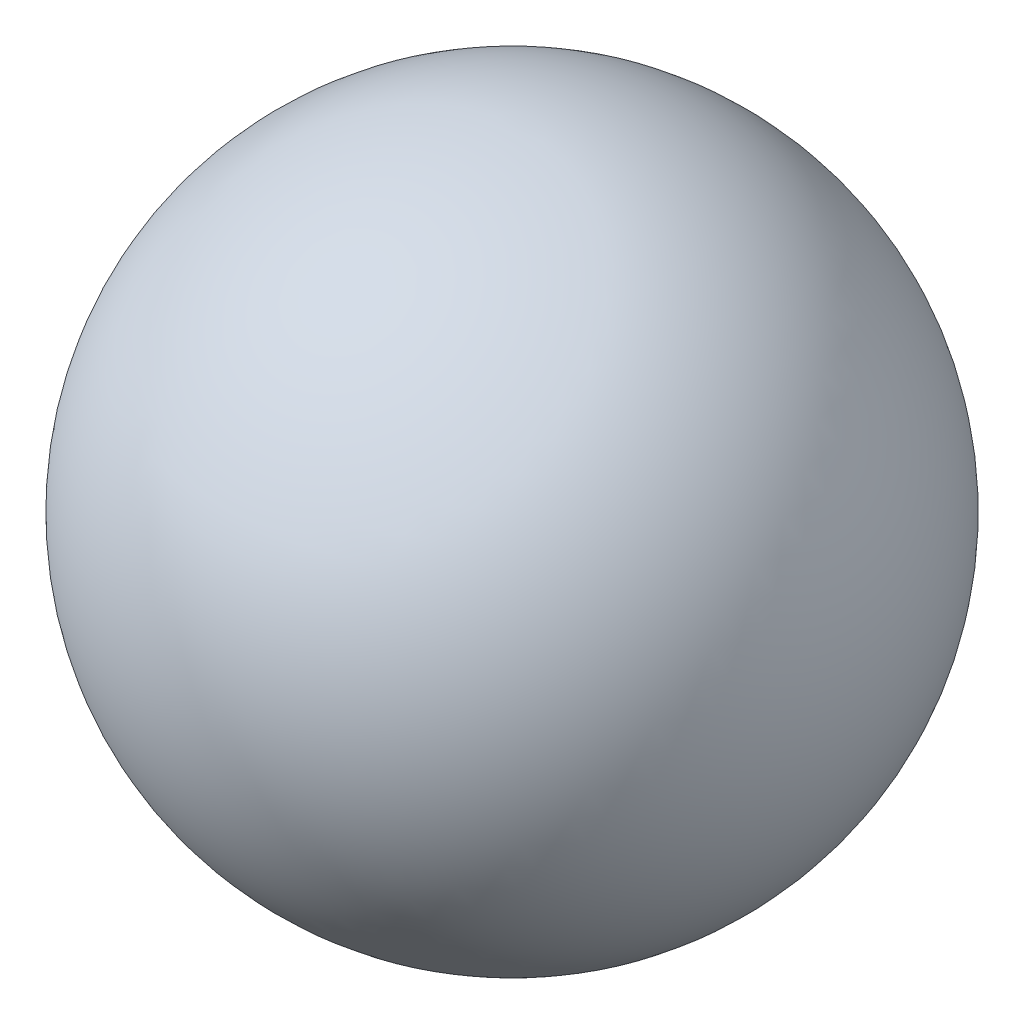
ISO-10303-21;
HEADER;
FILE_DESCRIPTION(('STEP AP214'),'2;1');
FILE_NAME('part.step','',(''),(''),'','','');
FILE_SCHEMA(('AUTOMOTIVE_DESIGN { 1 0 10303 214 1 1 1 1 }'));
ENDSEC;
DATA;
#1=APPLICATION_CONTEXT('core data for automotive mechanical design processes');
#2=APPLICATION_PROTOCOL_DEFINITION('international standard','automotive_design',2000,#1);
#3=PRODUCT_CONTEXT('',#1,'mechanical');
#4=PRODUCT('Part','Part','',(#3));
#5=PRODUCT_RELATED_PRODUCT_CATEGORY('part','',(#4));
#6=PRODUCT_DEFINITION_FORMATION('','',#4);
#7=PRODUCT_DEFINITION_CONTEXT('part definition',#1,'design');
#8=PRODUCT_DEFINITION('design','',#6,#7);
#9=PRODUCT_DEFINITION_SHAPE('','',#8);
#10=(LENGTH_UNIT() NAMED_UNIT(*) SI_UNIT(.MILLI.,.METRE.));
#11=(NAMED_UNIT(*) PLANE_ANGLE_UNIT() SI_UNIT($,.RADIAN.));
#12=(NAMED_UNIT(*) SI_UNIT($,.STERADIAN.) SOLID_ANGLE_UNIT());
#13=UNCERTAINTY_MEASURE_WITH_UNIT(LENGTH_MEASURE(1.E-05),#10,'distance_accuracy_value','');
#14=(GEOMETRIC_REPRESENTATION_CONTEXT(3) GLOBAL_UNCERTAINTY_ASSIGNED_CONTEXT((#13)) GLOBAL_UNIT_ASSIGNED_CONTEXT((#10,
#11,#12)) REPRESENTATION_CONTEXT('',''));
#15=CARTESIAN_POINT('',(0.,0.,0.));
#16=DIRECTION('',(0.,0.,1.));
#17=DIRECTION('',(1.,0.,0.));
#18=AXIS2_PLACEMENT_3D('',#15,#16,#17);
#19=CARTESIAN_POINT('',(0.,0.,0.));
#20=DIRECTION('',(0.,1.,0.));
#21=DIRECTION('',(-1.,0.,0.));
#22=AXIS2_PLACEMENT_3D('',#19,#20,#21);
#23=SPHERICAL_SURFACE('',#22,30.);
#24=CARTESIAN_POINT('',(0.,30.,0.));
#25=VERTEX_POINT('',#24);
#26=VERTEX_LOOP('',#25);
#27=FACE_BOUND('',#26,.T.);
#28=ADVANCED_FACE('F29',(#27),#23,.T.);
#29=CLOSED_SHELL('',(#28));
#30=MANIFOLD_SOLID_BREP('B2',#29);
#31=ADVANCED_BREP_SHAPE_REPRESENTATION('',(#18,#30),#14);
#32=SHAPE_DEFINITION_REPRESENTATION(#9,#31);
ENDSEC;
END-ISO-10303-21;
